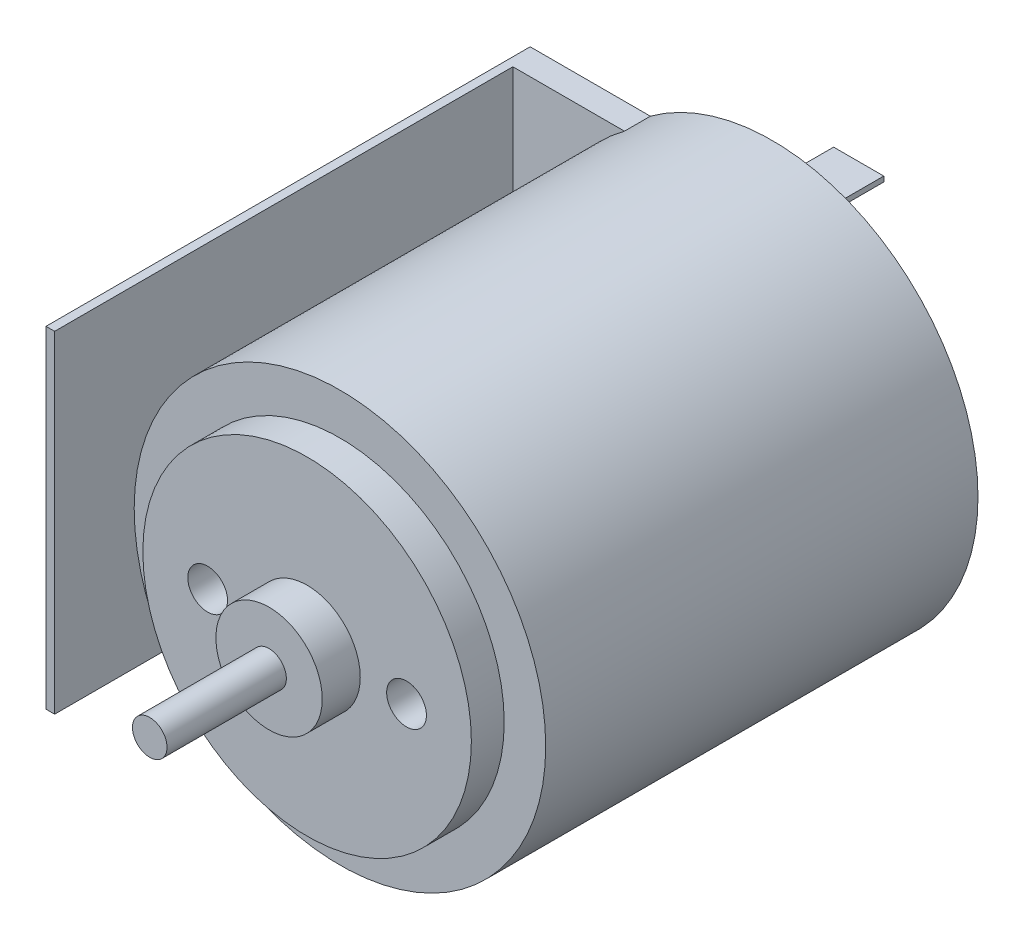
ISO-10303-21;
HEADER;
FILE_DESCRIPTION(('STEP AP214'),'2;1');
FILE_NAME('part.step','',(''),(''),'','','');
FILE_SCHEMA(('AUTOMOTIVE_DESIGN { 1 0 10303 214 1 1 1 1 }'));
ENDSEC;
DATA;
#1=APPLICATION_CONTEXT('core data for automotive mechanical design processes');
#2=APPLICATION_PROTOCOL_DEFINITION('international standard','automotive_design',2000,#1);
#3=PRODUCT_CONTEXT('',#1,'mechanical');
#4=PRODUCT('Part','Part','',(#3));
#5=PRODUCT_RELATED_PRODUCT_CATEGORY('part','',(#4));
#6=PRODUCT_DEFINITION_FORMATION('','',#4);
#7=PRODUCT_DEFINITION_CONTEXT('part definition',#1,'design');
#8=PRODUCT_DEFINITION('design','',#6,#7);
#9=PRODUCT_DEFINITION_SHAPE('','',#8);
#10=(LENGTH_UNIT() NAMED_UNIT(*) SI_UNIT(.MILLI.,.METRE.));
#11=(NAMED_UNIT(*) PLANE_ANGLE_UNIT() SI_UNIT($,.RADIAN.));
#12=(NAMED_UNIT(*) SI_UNIT($,.STERADIAN.) SOLID_ANGLE_UNIT());
#13=UNCERTAINTY_MEASURE_WITH_UNIT(LENGTH_MEASURE(1.E-05),#10,'distance_accuracy_value','');
#14=(GEOMETRIC_REPRESENTATION_CONTEXT(3) GLOBAL_UNCERTAINTY_ASSIGNED_CONTEXT((#13)) GLOBAL_UNIT_ASSIGNED_CONTEXT((#10,
#11,#12)) REPRESENTATION_CONTEXT('',''));
#15=CARTESIAN_POINT('',(0.,0.,0.));
#16=DIRECTION('',(0.,0.,1.));
#17=DIRECTION('',(1.,0.,0.));
#18=AXIS2_PLACEMENT_3D('',#15,#16,#17);
#19=CARTESIAN_POINT('',(0.,0.,0.));
#20=DIRECTION('',(0.,0.,1.));
#21=DIRECTION('',(1.,0.,0.));
#22=AXIS2_PLACEMENT_3D('',#19,#20,#21);
#23=PLANE('',#22);
#24=DIRECTION('',(-1.,0.,0.));
#25=VECTOR('',#24,1.);
#26=CARTESIAN_POINT('',(-4.,-9.5890064846753,0.));
#27=LINE('',#26,#25);
#28=CARTESIAN_POINT('',(-7.04705290436045,-9.5890064846753,0.));
#29=VERTEX_POINT('',#28);
#30=CARTESIAN_POINT('',(-14.,-9.5890064846753,0.));
#31=VERTEX_POINT('',#30);
#32=EDGE_CURVE('E193',#29,#31,#27,.T.);
#33=ORIENTED_EDGE('',*,*,#32,.T.);
#34=DIRECTION('',(0.,-1.,0.));
#35=VECTOR('',#34,1.);
#36=CARTESIAN_POINT('',(-14.,9.5890064846753,0.));
#37=LINE('',#36,#35);
#38=CARTESIAN_POINT('',(-14.,9.5890064846753,0.));
#39=VERTEX_POINT('',#38);
#40=EDGE_CURVE('E162',#39,#31,#37,.T.);
#41=ORIENTED_EDGE('',*,*,#40,.F.);
#42=DIRECTION('',(-1.,0.,0.));
#43=VECTOR('',#42,1.);
#44=CARTESIAN_POINT('',(-4.,9.5890064846753,0.));
#45=LINE('',#44,#43);
#46=CARTESIAN_POINT('',(-7.04705290436045,9.5890064846753,0.));
#47=VERTEX_POINT('',#46);
#48=EDGE_CURVE('E157',#47,#39,#45,.T.);
#49=ORIENTED_EDGE('',*,*,#48,.F.);
#50=CARTESIAN_POINT('',(0.,0.,0.));
#51=DIRECTION('',(0.,0.,1.));
#52=DIRECTION('',(1.,0.,0.));
#53=AXIS2_PLACEMENT_3D('',#50,#51,#52);
#54=CIRCLE('',#53,11.9);
#55=EDGE_CURVE('E283',#29,#47,#54,.T.);
#56=ORIENTED_EDGE('',*,*,#55,.F.);
#57=EDGE_LOOP('',(#33,#41,#49,#56));
#58=FACE_BOUND('',#57,.T.);
#59=CARTESIAN_POINT('',(0.,0.,0.));
#60=DIRECTION('',(0.,0.,1.));
#61=DIRECTION('',(1.,0.,0.));
#62=AXIS2_PLACEMENT_3D('',#59,#60,#61);
#63=CIRCLE('',#62,4.25);
#64=CARTESIAN_POINT('',(4.25,0.,0.));
#65=VERTEX_POINT('',#64);
#66=EDGE_CURVE('E290',#65,#65,#63,.T.);
#67=ORIENTED_EDGE('',*,*,#66,.T.);
#68=EDGE_LOOP('',(#67));
#69=FACE_BOUND('',#68,.T.);
#70=CARTESIAN_POINT('',(6.45,0.,0.));
#71=DIRECTION('',(0.,0.,-1.));
#72=DIRECTION('',(-1.,0.,0.));
#73=AXIS2_PLACEMENT_3D('',#70,#71,#72);
#74=CIRCLE('',#73,0.79999999999999);
#75=CARTESIAN_POINT('',(5.65000000000001,0.,0.));
#76=VERTEX_POINT('',#75);
#77=EDGE_CURVE('E202',#76,#76,#74,.T.);
#78=ORIENTED_EDGE('',*,*,#77,.F.);
#79=EDGE_LOOP('',(#78));
#80=FACE_BOUND('',#79,.T.);
#81=DIRECTION('',(-1.,0.,0.));
#82=VECTOR('',#81,1.);
#83=CARTESIAN_POINT('',(1.45,8.03971435369493,0.));
#84=LINE('',#83,#82);
#85=CARTESIAN_POINT('',(1.45,8.03971435369493,0.));
#86=VERTEX_POINT('',#85);
#87=CARTESIAN_POINT('',(-1.45,8.03971435369493,0.));
#88=VERTEX_POINT('',#87);
#89=EDGE_CURVE('E243',#86,#88,#84,.T.);
#90=ORIENTED_EDGE('',*,*,#89,.F.);
#91=DIRECTION('',(0.,-1.,0.));
#92=VECTOR('',#91,1.);
#93=CARTESIAN_POINT('',(1.45,8.33971435369493,0.));
#94=LINE('',#93,#92);
#95=CARTESIAN_POINT('',(1.45,8.33971435369493,0.));
#96=VERTEX_POINT('',#95);
#97=EDGE_CURVE('E255',#96,#86,#94,.T.);
#98=ORIENTED_EDGE('',*,*,#97,.F.);
#99=DIRECTION('',(-1.,0.,0.));
#100=VECTOR('',#99,1.);
#101=CARTESIAN_POINT('',(1.45,8.33971435369493,0.));
#102=LINE('',#101,#100);
#103=CARTESIAN_POINT('',(-1.45,8.33971435369493,0.));
#104=VERTEX_POINT('',#103);
#105=EDGE_CURVE('E268',#96,#104,#102,.T.);
#106=ORIENTED_EDGE('',*,*,#105,.T.);
#107=DIRECTION('',(0.,-1.,0.));
#108=VECTOR('',#107,1.);
#109=CARTESIAN_POINT('',(-1.45,8.33971435369493,0.));
#110=LINE('',#109,#108);
#111=EDGE_CURVE('E266',#104,#88,#110,.T.);
#112=ORIENTED_EDGE('',*,*,#111,.T.);
#113=EDGE_LOOP('',(#90,#98,#106,#112));
#114=FACE_BOUND('',#113,.T.);
#115=DIRECTION('',(1.,0.,0.));
#116=VECTOR('',#115,1.);
#117=CARTESIAN_POINT('',(-1.45000000000001,-7.50682965475162,0.));
#118=LINE('',#117,#116);
#119=CARTESIAN_POINT('',(-1.45000000000001,-7.50682965475162,0.));
#120=VERTEX_POINT('',#119);
#121=CARTESIAN_POINT('',(1.44999999999999,-7.50682965475162,0.));
#122=VERTEX_POINT('',#121);
#123=EDGE_CURVE('E240',#120,#122,#118,.T.);
#124=ORIENTED_EDGE('',*,*,#123,.F.);
#125=DIRECTION('',(0.,1.,0.));
#126=VECTOR('',#125,1.);
#127=CARTESIAN_POINT('',(-1.45000000000001,-7.80682965475162,0.));
#128=LINE('',#127,#126);
#129=CARTESIAN_POINT('',(-1.45000000000001,-7.80682965475162,0.));
#130=VERTEX_POINT('',#129);
#131=EDGE_CURVE('E232',#130,#120,#128,.T.);
#132=ORIENTED_EDGE('',*,*,#131,.F.);
#133=DIRECTION('',(1.,0.,0.));
#134=VECTOR('',#133,1.);
#135=CARTESIAN_POINT('',(-1.45000000000001,-7.80682965475162,0.));
#136=LINE('',#135,#134);
#137=CARTESIAN_POINT('',(1.44999999999999,-7.80682965475162,0.));
#138=VERTEX_POINT('',#137);
#139=EDGE_CURVE('E235',#130,#138,#136,.T.);
#140=ORIENTED_EDGE('',*,*,#139,.T.);
#141=DIRECTION('',(0.,1.,0.));
#142=VECTOR('',#141,1.);
#143=CARTESIAN_POINT('',(1.44999999999999,-7.80682965475162,0.));
#144=LINE('',#143,#142);
#145=EDGE_CURVE('E238',#138,#122,#144,.T.);
#146=ORIENTED_EDGE('',*,*,#145,.T.);
#147=EDGE_LOOP('',(#124,#132,#140,#146));
#148=FACE_BOUND('',#147,.T.);
#149=ADVANCED_FACE('F44',(#58,#69,#80,#114,#148),#23,.F.);
#150=CARTESIAN_POINT('',(0.,0.,36.));
#151=DIRECTION('',(0.,0.,-1.));
#152=DIRECTION('',(-1.,0.,0.));
#153=AXIS2_PLACEMENT_3D('',#150,#151,#152);
#154=CYLINDRICAL_SURFACE('',#153,1.);
#155=CARTESIAN_POINT('',(0.,0.,29.1));
#156=DIRECTION('',(0.,0.,1.));
#157=DIRECTION('',(1.,0.,0.));
#158=AXIS2_PLACEMENT_3D('',#155,#156,#157);
#159=CIRCLE('',#158,1.);
#160=CARTESIAN_POINT('',(1.,0.,29.1));
#161=VERTEX_POINT('',#160);
#162=EDGE_CURVE('E307',#161,#161,#159,.T.);
#163=ORIENTED_EDGE('',*,*,#162,.T.);
#164=EDGE_LOOP('',(#163));
#165=FACE_BOUND('',#164,.T.);
#166=CARTESIAN_POINT('',(0.,0.,36.));
#167=DIRECTION('',(0.,0.,1.));
#168=DIRECTION('',(1.,0.,0.));
#169=AXIS2_PLACEMENT_3D('',#166,#167,#168);
#170=CIRCLE('',#169,1.);
#171=CARTESIAN_POINT('',(1.,0.,36.));
#172=VERTEX_POINT('',#171);
#173=EDGE_CURVE('E313',#172,#172,#170,.T.);
#174=ORIENTED_EDGE('',*,*,#173,.F.);
#175=EDGE_LOOP('',(#174));
#176=FACE_BOUND('',#175,.T.);
#177=ADVANCED_FACE('F46',(#165,#176),#154,.T.);
#178=CARTESIAN_POINT('',(0.,0.,36.));
#179=DIRECTION('',(0.,0.,1.));
#180=DIRECTION('',(1.,0.,0.));
#181=AXIS2_PLACEMENT_3D('',#178,#179,#180);
#182=PLANE('',#181);
#183=ORIENTED_EDGE('',*,*,#173,.T.);
#184=EDGE_LOOP('',(#183));
#185=FACE_BOUND('',#184,.T.);
#186=ADVANCED_FACE('F428',(#185),#182,.T.);
#187=CARTESIAN_POINT('',(0.,0.,29.1));
#188=DIRECTION('',(0.,0.,-1.));
#189=DIRECTION('',(-1.,0.,0.));
#190=AXIS2_PLACEMENT_3D('',#187,#188,#189);
#191=CYLINDRICAL_SURFACE('',#190,3.075);
#192=CARTESIAN_POINT('',(0.,0.,26.9));
#193=DIRECTION('',(0.,0.,1.));
#194=DIRECTION('',(1.,0.,0.));
#195=AXIS2_PLACEMENT_3D('',#192,#193,#194);
#196=CIRCLE('',#195,3.075);
#197=CARTESIAN_POINT('',(3.075,0.,26.9));
#198=VERTEX_POINT('',#197);
#199=EDGE_CURVE('E295',#198,#198,#196,.T.);
#200=ORIENTED_EDGE('',*,*,#199,.T.);
#201=EDGE_LOOP('',(#200));
#202=FACE_BOUND('',#201,.T.);
#203=CARTESIAN_POINT('',(0.,0.,29.1));
#204=DIRECTION('',(0.,0.,1.));
#205=DIRECTION('',(1.,0.,0.));
#206=AXIS2_PLACEMENT_3D('',#203,#204,#205);
#207=CIRCLE('',#206,3.075);
#208=CARTESIAN_POINT('',(3.075,0.,29.1));
#209=VERTEX_POINT('',#208);
#210=EDGE_CURVE('E310',#209,#209,#207,.T.);
#211=ORIENTED_EDGE('',*,*,#210,.F.);
#212=EDGE_LOOP('',(#211));
#213=FACE_BOUND('',#212,.T.);
#214=ADVANCED_FACE('F424',(#202,#213),#191,.T.);
#215=CARTESIAN_POINT('',(0.,0.,29.1));
#216=DIRECTION('',(0.,0.,1.));
#217=DIRECTION('',(1.,0.,0.));
#218=AXIS2_PLACEMENT_3D('',#215,#216,#217);
#219=PLANE('',#218);
#220=ORIENTED_EDGE('',*,*,#162,.F.);
#221=EDGE_LOOP('',(#220));
#222=FACE_BOUND('',#221,.T.);
#223=ORIENTED_EDGE('',*,*,#210,.T.);
#224=EDGE_LOOP('',(#223));
#225=FACE_BOUND('',#224,.T.);
#226=ADVANCED_FACE('F409',(#222,#225),#219,.T.);
#227=CARTESIAN_POINT('',(0.,0.,26.9));
#228=DIRECTION('',(0.,0.,1.));
#229=DIRECTION('',(1.,0.,0.));
#230=AXIS2_PLACEMENT_3D('',#227,#228,#229);
#231=PLANE('',#230);
#232=CARTESIAN_POINT('',(5.75,0.,26.9));
#233=DIRECTION('',(0.,0.,1.));
#234=DIRECTION('',(1.,0.,0.));
#235=AXIS2_PLACEMENT_3D('',#232,#233,#234);
#236=CIRCLE('',#235,1.15);
#237=CARTESIAN_POINT('',(6.9,0.,26.9));
#238=VERTEX_POINT('',#237);
#239=EDGE_CURVE('E203',#238,#238,#236,.T.);
#240=ORIENTED_EDGE('',*,*,#239,.F.);
#241=EDGE_LOOP('',(#240));
#242=FACE_BOUND('',#241,.T.);
#243=CARTESIAN_POINT('',(-5.75,0.,26.9));
#244=DIRECTION('',(0.,0.,1.));
#245=DIRECTION('',(1.,0.,0.));
#246=AXIS2_PLACEMENT_3D('',#243,#244,#245);
#247=CIRCLE('',#246,1.15);
#248=CARTESIAN_POINT('',(-4.6,0.,26.9));
#249=VERTEX_POINT('',#248);
#250=EDGE_CURVE('E206',#249,#249,#247,.T.);
#251=ORIENTED_EDGE('',*,*,#250,.F.);
#252=EDGE_LOOP('',(#251));
#253=FACE_BOUND('',#252,.T.);
#254=ORIENTED_EDGE('',*,*,#199,.F.);
#255=EDGE_LOOP('',(#254));
#256=FACE_BOUND('',#255,.T.);
#257=CARTESIAN_POINT('',(0.,0.,26.9));
#258=DIRECTION('',(0.,0.,1.));
#259=DIRECTION('',(1.,0.,0.));
#260=AXIS2_PLACEMENT_3D('',#257,#258,#259);
#261=CIRCLE('',#260,9.5);
#262=CARTESIAN_POINT('',(-9.5,0.,26.9));
#263=VERTEX_POINT('',#262);
#264=EDGE_CURVE('E292',#263,#263,#261,.T.);
#265=ORIENTED_EDGE('',*,*,#264,.T.);
#266=EDGE_LOOP('',(#265));
#267=FACE_BOUND('',#266,.T.);
#268=ADVANCED_FACE('F405',(#242,#253,#256,#267),#231,.T.);
#269=CARTESIAN_POINT('',(0.,0.,26.9));
#270=DIRECTION('',(0.,0.,-1.));
#271=DIRECTION('',(-1.,0.,0.));
#272=AXIS2_PLACEMENT_3D('',#269,#270,#271);
#273=CYLINDRICAL_SURFACE('',#272,9.5);
#274=CARTESIAN_POINT('',(0.,0.,25.));
#275=DIRECTION('',(0.,0.,1.));
#276=DIRECTION('',(1.,0.,0.));
#277=AXIS2_PLACEMENT_3D('',#274,#275,#276);
#278=CIRCLE('',#277,9.5);
#279=CARTESIAN_POINT('',(-9.5,0.,25.));
#280=VERTEX_POINT('',#279);
#281=EDGE_CURVE('E284',#280,#280,#278,.T.);
#282=CARTESIAN_POINT('',(-9.5,0.,25.));
#283=CARTESIAN_POINT('',(-9.5,0.,25.0197916666667));
#284=CARTESIAN_POINT('',(-9.5,0.,25.0395833333333));
#285=CARTESIAN_POINT('',(-9.5,0.,25.0791666666667));
#286=CARTESIAN_POINT('',(-9.5,0.,25.0989583333333));
#287=CARTESIAN_POINT('',(-9.5,0.,25.1385416666667));
#288=CARTESIAN_POINT('',(-9.5,0.,25.1583333333333));
#289=CARTESIAN_POINT('',(-9.5,0.,25.1979166666667));
#290=CARTESIAN_POINT('',(-9.5,0.,25.2177083333333));
#291=CARTESIAN_POINT('',(-9.5,0.,25.2572916666667));
#292=CARTESIAN_POINT('',(-9.5,0.,25.2770833333333));
#293=CARTESIAN_POINT('',(-9.5,0.,25.3166666666667));
#294=CARTESIAN_POINT('',(-9.5,0.,25.3364583333333));
#295=CARTESIAN_POINT('',(-9.5,0.,25.3760416666667));
#296=CARTESIAN_POINT('',(-9.5,0.,25.3958333333333));
#297=CARTESIAN_POINT('',(-9.5,0.,25.4354166666667));
#298=CARTESIAN_POINT('',(-9.5,0.,25.4552083333333));
#299=CARTESIAN_POINT('',(-9.5,0.,25.4947916666667));
#300=CARTESIAN_POINT('',(-9.5,0.,25.5145833333333));
#301=CARTESIAN_POINT('',(-9.5,0.,25.5541666666667));
#302=CARTESIAN_POINT('',(-9.5,0.,25.5739583333333));
#303=CARTESIAN_POINT('',(-9.5,0.,25.6135416666667));
#304=CARTESIAN_POINT('',(-9.5,0.,25.6333333333333));
#305=CARTESIAN_POINT('',(-9.5,0.,25.6729166666667));
#306=CARTESIAN_POINT('',(-9.5,0.,25.6927083333333));
#307=CARTESIAN_POINT('',(-9.5,0.,25.7322916666667));
#308=CARTESIAN_POINT('',(-9.5,0.,25.7520833333333));
#309=CARTESIAN_POINT('',(-9.5,0.,25.7916666666667));
#310=CARTESIAN_POINT('',(-9.5,0.,25.8114583333333));
#311=CARTESIAN_POINT('',(-9.5,0.,25.8510416666667));
#312=CARTESIAN_POINT('',(-9.5,0.,25.8708333333333));
#313=CARTESIAN_POINT('',(-9.5,0.,25.9104166666667));
#314=CARTESIAN_POINT('',(-9.5,0.,25.9302083333333));
#315=CARTESIAN_POINT('',(-9.5,0.,25.9697916666667));
#316=CARTESIAN_POINT('',(-9.5,0.,25.9895833333333));
#317=CARTESIAN_POINT('',(-9.5,0.,26.0291666666667));
#318=CARTESIAN_POINT('',(-9.5,0.,26.0489583333333));
#319=CARTESIAN_POINT('',(-9.5,0.,26.0885416666667));
#320=CARTESIAN_POINT('',(-9.5,0.,26.1083333333333));
#321=CARTESIAN_POINT('',(-9.5,0.,26.1479166666667));
#322=CARTESIAN_POINT('',(-9.5,0.,26.1677083333333));
#323=CARTESIAN_POINT('',(-9.5,0.,26.2072916666667));
#324=CARTESIAN_POINT('',(-9.5,0.,26.2270833333333));
#325=CARTESIAN_POINT('',(-9.5,0.,26.2666666666667));
#326=CARTESIAN_POINT('',(-9.5,0.,26.2864583333333));
#327=CARTESIAN_POINT('',(-9.5,0.,26.3260416666667));
#328=CARTESIAN_POINT('',(-9.5,0.,26.3458333333333));
#329=CARTESIAN_POINT('',(-9.5,0.,26.3854166666667));
#330=CARTESIAN_POINT('',(-9.5,0.,26.4052083333333));
#331=CARTESIAN_POINT('',(-9.5,0.,26.4447916666667));
#332=CARTESIAN_POINT('',(-9.5,0.,26.4645833333333));
#333=CARTESIAN_POINT('',(-9.5,0.,26.5041666666667));
#334=CARTESIAN_POINT('',(-9.5,0.,26.5239583333333));
#335=CARTESIAN_POINT('',(-9.5,0.,26.5635416666667));
#336=CARTESIAN_POINT('',(-9.5,0.,26.5833333333333));
#337=CARTESIAN_POINT('',(-9.5,0.,26.6229166666667));
#338=CARTESIAN_POINT('',(-9.5,0.,26.6427083333333));
#339=CARTESIAN_POINT('',(-9.5,0.,26.6822916666667));
#340=CARTESIAN_POINT('',(-9.5,0.,26.7020833333333));
#341=CARTESIAN_POINT('',(-9.5,0.,26.7416666666667));
#342=CARTESIAN_POINT('',(-9.5,0.,26.7614583333333));
#343=CARTESIAN_POINT('',(-9.5,0.,26.8010416666667));
#344=CARTESIAN_POINT('',(-9.5,0.,26.8208333333333));
#345=CARTESIAN_POINT('',(-9.5,0.,26.8604166666667));
#346=CARTESIAN_POINT('',(-9.5,0.,26.8802083333333));
#347=CARTESIAN_POINT('',(-9.5,0.,26.9));
#348=B_SPLINE_CURVE_WITH_KNOTS('',3,(#282,#283,#284,#285,#286,#287,#288,#289,#290,#291,#292,
#293,#294,#295,#296,#297,#298,#299,#300,#301,#302,#303,#304,#305,#306,#307,#308,#309,#310,#311,
#312,#313,#314,#315,#316,#317,#318,#319,#320,#321,#322,#323,#324,#325,#326,#327,#328,#329,#330,
#331,#332,#333,#334,#335,#336,#337,#338,#339,#340,#341,#342,#343,#344,#345,#346,#347),
.UNSPECIFIED.,.F.,.F.,(4,2,2,2,2,2,2,2,2,2,2,2,2,2,2,2,2,2,2,2,2,2,2,2,2,2,2,2,2,2,2,2,4),(0.,
0.0593750000000004,0.118750000000001,0.178125000000001,0.237500000000002,0.296875000000002,
0.356250000000002,0.415625000000003,0.475,0.534375,0.593750000000001,0.653125000000001,
0.712500000000001,0.771875000000002,0.831250000000002,0.890625000000003,0.95,1.009375,1.06875,
1.128125,1.1875,1.246875,1.30625,1.365625,1.425,1.484375,1.54375,1.603125,1.6625,1.721875,
1.78125,1.840625,1.9),.UNSPECIFIED.);
#349=EDGE_CURVE('BSEAM400',#280,#263,#348,.T.);
#350=ORIENTED_EDGE('',*,*,#281,.T.);
#351=ORIENTED_EDGE('',*,*,#264,.F.);
#352=ORIENTED_EDGE('',*,*,#349,.T.);
#353=ORIENTED_EDGE('',*,*,#349,.F.);
#354=EDGE_LOOP('',(#350,#352,#351,#353));
#355=FACE_BOUND('',#354,.T.);
#356=ADVANCED_FACE('F400',(#355),#273,.T.);
#357=CARTESIAN_POINT('',(0.,0.,25.));
#358=DIRECTION('',(0.,0.,-1.));
#359=DIRECTION('',(-1.,0.,0.));
#360=AXIS2_PLACEMENT_3D('',#357,#358,#359);
#361=CYLINDRICAL_SURFACE('',#360,11.9);
#362=CARTESIAN_POINT('',(0.,0.,25.));
#363=DIRECTION('',(0.,0.,1.));
#364=DIRECTION('',(1.,0.,0.));
#365=AXIS2_PLACEMENT_3D('',#362,#363,#364);
#366=CIRCLE('',#365,11.9);
#367=CARTESIAN_POINT('',(11.9,0.,25.));
#368=VERTEX_POINT('',#367);
#369=EDGE_CURVE('E287',#368,#368,#366,.T.);
#370=ORIENTED_EDGE('',*,*,#369,.F.);
#371=EDGE_LOOP('',(#370));
#372=FACE_BOUND('',#371,.T.);
#373=ORIENTED_EDGE('',*,*,#55,.T.);
#374=DIRECTION('',(0.,0.,-1.));
#375=VECTOR('',#374,1.);
#376=CARTESIAN_POINT('',(-7.04705290436045,9.5890064846753,25.));
#377=LINE('',#376,#375);
#378=CARTESIAN_POINT('',(-7.04705290436045,9.5890064846753,1.5));
#379=VERTEX_POINT('',#378);
#380=EDGE_CURVE('E53',#47,#379,#377,.F.);
#381=ORIENTED_EDGE('',*,*,#380,.T.);
#382=CARTESIAN_POINT('',(0.,0.,1.5));
#383=DIRECTION('',(0.,0.,1.));
#384=DIRECTION('',(0.,-1.,0.));
#385=AXIS2_PLACEMENT_3D('',#382,#383,#384);
#386=CIRCLE('',#385,11.9);
#387=CARTESIAN_POINT('',(-7.04705290436045,-9.5890064846753,1.5));
#388=VERTEX_POINT('',#387);
#389=EDGE_CURVE('E196',#379,#388,#386,.T.);
#390=ORIENTED_EDGE('',*,*,#389,.T.);
#391=DIRECTION('',(0.,0.,-1.));
#392=VECTOR('',#391,1.);
#393=CARTESIAN_POINT('',(-7.04705290436045,-9.5890064846753,25.));
#394=LINE('',#393,#392);
#395=EDGE_CURVE('E318',#388,#29,#394,.T.);
#396=ORIENTED_EDGE('',*,*,#395,.T.);
#397=EDGE_LOOP('',(#373,#381,#390,#396));
#398=FACE_BOUND('',#397,.T.);
#399=ADVANCED_FACE('F323',(#372,#398),#361,.T.);
#400=CARTESIAN_POINT('',(0.,0.,25.));
#401=DIRECTION('',(0.,0.,1.));
#402=DIRECTION('',(1.,0.,0.));
#403=AXIS2_PLACEMENT_3D('',#400,#401,#402);
#404=PLANE('',#403);
#405=ORIENTED_EDGE('',*,*,#281,.F.);
#406=EDGE_LOOP('',(#405));
#407=FACE_BOUND('',#406,.T.);
#408=ORIENTED_EDGE('',*,*,#369,.T.);
#409=EDGE_LOOP('',(#408));
#410=FACE_BOUND('',#409,.T.);
#411=ADVANCED_FACE('F394',(#407,#410),#404,.T.);
#412=CARTESIAN_POINT('',(0.,0.,0.));
#413=DIRECTION('',(0.,0.,1.));
#414=DIRECTION('',(1.,0.,0.));
#415=AXIS2_PLACEMENT_3D('',#412,#413,#414);
#416=PLANE('',#415);
#417=CARTESIAN_POINT('',(0.,0.,0.));
#418=DIRECTION('',(0.,0.,1.));
#419=DIRECTION('',(1.,0.,0.));
#420=AXIS2_PLACEMENT_3D('',#417,#418,#419);
#421=CIRCLE('',#420,3.075);
#422=CARTESIAN_POINT('',(3.075,0.,0.));
#423=VERTEX_POINT('',#422);
#424=EDGE_CURVE('E306',#423,#423,#421,.T.);
#425=ORIENTED_EDGE('',*,*,#424,.F.);
#426=EDGE_LOOP('',(#425));
#427=FACE_BOUND('',#426,.T.);
#428=ADVANCED_FACE('F397',(#427),#416,.F.);
#429=CARTESIAN_POINT('',(0.,0.,-2.));
#430=DIRECTION('',(0.,0.,1.));
#431=DIRECTION('',(1.,0.,0.));
#432=AXIS2_PLACEMENT_3D('',#429,#430,#431);
#433=CYLINDRICAL_SURFACE('',#432,3.075);
#434=CARTESIAN_POINT('',(0.,0.,-2.));
#435=DIRECTION('',(0.,0.,1.));
#436=DIRECTION('',(1.,0.,0.));
#437=AXIS2_PLACEMENT_3D('',#434,#435,#436);
#438=CIRCLE('',#437,3.075);
#439=CARTESIAN_POINT('',(3.075,0.,-2.));
#440=VERTEX_POINT('',#439);
#441=EDGE_CURVE('E300',#440,#440,#438,.T.);
#442=ORIENTED_EDGE('',*,*,#441,.F.);
#443=EDGE_LOOP('',(#442));
#444=FACE_BOUND('',#443,.T.);
#445=ORIENTED_EDGE('',*,*,#424,.T.);
#446=EDGE_LOOP('',(#445));
#447=FACE_BOUND('',#446,.T.);
#448=ADVANCED_FACE('F414',(#444,#447),#433,.F.);
#449=CARTESIAN_POINT('',(0.,0.,-2.));
#450=DIRECTION('',(0.,0.,1.));
#451=DIRECTION('',(1.,0.,0.));
#452=AXIS2_PLACEMENT_3D('',#449,#450,#451);
#453=PLANE('',#452);
#454=ORIENTED_EDGE('',*,*,#441,.T.);
#455=EDGE_LOOP('',(#454));
#456=FACE_BOUND('',#455,.T.);
#457=CARTESIAN_POINT('',(0.,0.,-2.));
#458=DIRECTION('',(0.,0.,1.));
#459=DIRECTION('',(1.,0.,0.));
#460=AXIS2_PLACEMENT_3D('',#457,#458,#459);
#461=CIRCLE('',#460,4.25);
#462=CARTESIAN_POINT('',(4.25,0.,-2.));
#463=VERTEX_POINT('',#462);
#464=EDGE_CURVE('E303',#463,#463,#461,.T.);
#465=ORIENTED_EDGE('',*,*,#464,.F.);
#466=EDGE_LOOP('',(#465));
#467=FACE_BOUND('',#466,.T.);
#468=ADVANCED_FACE('F411',(#456,#467),#453,.F.);
#469=CARTESIAN_POINT('',(0.,0.,-2.));
#470=DIRECTION('',(0.,0.,1.));
#471=DIRECTION('',(1.,0.,0.));
#472=AXIS2_PLACEMENT_3D('',#469,#470,#471);
#473=CYLINDRICAL_SURFACE('',#472,4.25);
#474=ORIENTED_EDGE('',*,*,#464,.T.);
#475=EDGE_LOOP('',(#474));
#476=FACE_BOUND('',#475,.T.);
#477=ORIENTED_EDGE('',*,*,#66,.F.);
#478=EDGE_LOOP('',(#477));
#479=FACE_BOUND('',#478,.T.);
#480=ADVANCED_FACE('F392',(#476,#479),#473,.T.);
#481=CARTESIAN_POINT('',(1.45,8.03971435369493,-5.));
#482=DIRECTION('',(0.,1.,0.));
#483=DIRECTION('',(0.,0.,1.));
#484=AXIS2_PLACEMENT_3D('',#481,#482,#483);
#485=PLANE('',#484);
#486=ORIENTED_EDGE('',*,*,#89,.T.);
#487=DIRECTION('',(0.,0.,1.));
#488=VECTOR('',#487,1.);
#489=CARTESIAN_POINT('',(-1.45,8.03971435369493,-5.));
#490=LINE('',#489,#488);
#491=CARTESIAN_POINT('',(-1.45,8.03971435369493,-5.));
#492=VERTEX_POINT('',#491);
#493=EDGE_CURVE('E280',#492,#88,#490,.T.);
#494=ORIENTED_EDGE('',*,*,#493,.F.);
#495=DIRECTION('',(-1.,0.,0.));
#496=VECTOR('',#495,1.);
#497=CARTESIAN_POINT('',(1.45,8.03971435369493,-5.));
#498=LINE('',#497,#496);
#499=CARTESIAN_POINT('',(1.45,8.03971435369493,-5.));
#500=VERTEX_POINT('',#499);
#501=EDGE_CURVE('E252',#500,#492,#498,.T.);
#502=ORIENTED_EDGE('',*,*,#501,.F.);
#503=DIRECTION('',(0.,0.,1.));
#504=VECTOR('',#503,1.);
#505=CARTESIAN_POINT('',(1.45,8.03971435369493,-5.));
#506=LINE('',#505,#504);
#507=EDGE_CURVE('E263',#500,#86,#506,.T.);
#508=ORIENTED_EDGE('',*,*,#507,.T.);
#509=EDGE_LOOP('',(#486,#494,#502,#508));
#510=FACE_BOUND('',#509,.T.);
#511=ADVANCED_FACE('F388',(#510),#485,.F.);
#512=CARTESIAN_POINT('',(-1.45,8.33971435369493,-5.));
#513=DIRECTION('',(-1.,0.,0.));
#514=DIRECTION('',(0.,-1.,0.));
#515=AXIS2_PLACEMENT_3D('',#512,#513,#514);
#516=PLANE('',#515);
#517=ORIENTED_EDGE('',*,*,#111,.F.);
#518=DIRECTION('',(0.,0.,1.));
#519=VECTOR('',#518,1.);
#520=CARTESIAN_POINT('',(-1.45,8.33971435369493,-5.));
#521=LINE('',#520,#519);
#522=CARTESIAN_POINT('',(-1.45,8.33971435369493,-5.));
#523=VERTEX_POINT('',#522);
#524=EDGE_CURVE('E277',#523,#104,#521,.T.);
#525=ORIENTED_EDGE('',*,*,#524,.F.);
#526=DIRECTION('',(0.,-1.,0.));
#527=VECTOR('',#526,1.);
#528=CARTESIAN_POINT('',(-1.45,8.33971435369493,-5.));
#529=LINE('',#528,#527);
#530=EDGE_CURVE('E254',#523,#492,#529,.T.);
#531=ORIENTED_EDGE('',*,*,#530,.T.);
#532=ORIENTED_EDGE('',*,*,#493,.T.);
#533=EDGE_LOOP('',(#517,#525,#531,#532));
#534=FACE_BOUND('',#533,.T.);
#535=ADVANCED_FACE('F384',(#534),#516,.T.);
#536=CARTESIAN_POINT('',(1.45,8.33971435369493,-5.));
#537=DIRECTION('',(0.,1.,0.));
#538=DIRECTION('',(0.,0.,1.));
#539=AXIS2_PLACEMENT_3D('',#536,#537,#538);
#540=PLANE('',#539);
#541=ORIENTED_EDGE('',*,*,#105,.F.);
#542=DIRECTION('',(0.,0.,1.));
#543=VECTOR('',#542,1.);
#544=CARTESIAN_POINT('',(1.45,8.33971435369493,-5.));
#545=LINE('',#544,#543);
#546=CARTESIAN_POINT('',(1.45,8.33971435369493,-5.));
#547=VERTEX_POINT('',#546);
#548=EDGE_CURVE('E274',#547,#96,#545,.T.);
#549=ORIENTED_EDGE('',*,*,#548,.F.);
#550=DIRECTION('',(-1.,0.,0.));
#551=VECTOR('',#550,1.);
#552=CARTESIAN_POINT('',(1.45,8.33971435369493,-5.));
#553=LINE('',#552,#551);
#554=EDGE_CURVE('E258',#547,#523,#553,.T.);
#555=ORIENTED_EDGE('',*,*,#554,.T.);
#556=ORIENTED_EDGE('',*,*,#524,.T.);
#557=EDGE_LOOP('',(#541,#549,#555,#556));
#558=FACE_BOUND('',#557,.T.);
#559=ADVANCED_FACE('F380',(#558),#540,.T.);
#560=CARTESIAN_POINT('',(1.45,8.33971435369493,-5.));
#561=DIRECTION('',(-1.,0.,0.));
#562=DIRECTION('',(0.,0.,1.));
#563=AXIS2_PLACEMENT_3D('',#560,#561,#562);
#564=PLANE('',#563);
#565=ORIENTED_EDGE('',*,*,#97,.T.);
#566=ORIENTED_EDGE('',*,*,#507,.F.);
#567=DIRECTION('',(0.,-1.,0.));
#568=VECTOR('',#567,1.);
#569=CARTESIAN_POINT('',(1.45,8.33971435369493,-5.));
#570=LINE('',#569,#568);
#571=EDGE_CURVE('E261',#547,#500,#570,.T.);
#572=ORIENTED_EDGE('',*,*,#571,.F.);
#573=ORIENTED_EDGE('',*,*,#548,.T.);
#574=EDGE_LOOP('',(#565,#566,#572,#573));
#575=FACE_BOUND('',#574,.T.);
#576=ADVANCED_FACE('F376',(#575),#564,.F.);
#577=CARTESIAN_POINT('',(0.,0.,-5.));
#578=DIRECTION('',(0.,0.,1.));
#579=DIRECTION('',(1.,0.,0.));
#580=AXIS2_PLACEMENT_3D('',#577,#578,#579);
#581=PLANE('',#580);
#582=ORIENTED_EDGE('',*,*,#501,.T.);
#583=ORIENTED_EDGE('',*,*,#530,.F.);
#584=ORIENTED_EDGE('',*,*,#554,.F.);
#585=ORIENTED_EDGE('',*,*,#571,.T.);
#586=EDGE_LOOP('',(#582,#583,#584,#585));
#587=FACE_BOUND('',#586,.T.);
#588=ADVANCED_FACE('F365',(#587),#581,.F.);
#589=CARTESIAN_POINT('',(-1.45000000000001,-7.50682965475162,-5.));
#590=DIRECTION('',(0.,-1.,0.));
#591=DIRECTION('',(0.,0.,-1.));
#592=AXIS2_PLACEMENT_3D('',#589,#590,#591);
#593=PLANE('',#592);
#594=ORIENTED_EDGE('',*,*,#123,.T.);
#595=DIRECTION('',(0.,0.,1.));
#596=VECTOR('',#595,1.);
#597=CARTESIAN_POINT('',(1.44999999999999,-7.50682965475162,-5.));
#598=LINE('',#597,#596);
#599=CARTESIAN_POINT('',(1.44999999999999,-7.50682965475162,-5.));
#600=VERTEX_POINT('',#599);
#601=EDGE_CURVE('E219',#600,#122,#598,.T.);
#602=ORIENTED_EDGE('',*,*,#601,.F.);
#603=DIRECTION('',(1.,0.,0.));
#604=VECTOR('',#603,1.);
#605=CARTESIAN_POINT('',(-1.45000000000001,-7.50682965475162,-5.));
#606=LINE('',#605,#604);
#607=CARTESIAN_POINT('',(-1.45000000000001,-7.50682965475162,-5.));
#608=VERTEX_POINT('',#607);
#609=EDGE_CURVE('E236',#608,#600,#606,.T.);
#610=ORIENTED_EDGE('',*,*,#609,.F.);
#611=DIRECTION('',(0.,0.,1.));
#612=VECTOR('',#611,1.);
#613=CARTESIAN_POINT('',(-1.45000000000001,-7.50682965475162,-5.));
#614=LINE('',#613,#612);
#615=EDGE_CURVE('E228',#608,#120,#614,.T.);
#616=ORIENTED_EDGE('',*,*,#615,.T.);
#617=EDGE_LOOP('',(#594,#602,#610,#616));
#618=FACE_BOUND('',#617,.T.);
#619=ADVANCED_FACE('F349',(#618),#593,.F.);
#620=CARTESIAN_POINT('',(1.44999999999999,-7.80682965475162,-5.));
#621=DIRECTION('',(1.,0.,0.));
#622=DIRECTION('',(0.,0.,-1.));
#623=AXIS2_PLACEMENT_3D('',#620,#621,#622);
#624=PLANE('',#623);
#625=ORIENTED_EDGE('',*,*,#145,.F.);
#626=DIRECTION('',(0.,0.,1.));
#627=VECTOR('',#626,1.);
#628=CARTESIAN_POINT('',(1.44999999999999,-7.80682965475162,-5.));
#629=LINE('',#628,#627);
#630=CARTESIAN_POINT('',(1.44999999999999,-7.80682965475162,-5.));
#631=VERTEX_POINT('',#630);
#632=EDGE_CURVE('E222',#631,#138,#629,.T.);
#633=ORIENTED_EDGE('',*,*,#632,.F.);
#634=DIRECTION('',(0.,1.,0.));
#635=VECTOR('',#634,1.);
#636=CARTESIAN_POINT('',(1.44999999999999,-7.80682965475162,-5.));
#637=LINE('',#636,#635);
#638=EDGE_CURVE('E248',#631,#600,#637,.T.);
#639=ORIENTED_EDGE('',*,*,#638,.T.);
#640=ORIENTED_EDGE('',*,*,#601,.T.);
#641=EDGE_LOOP('',(#625,#633,#639,#640));
#642=FACE_BOUND('',#641,.T.);
#643=ADVANCED_FACE('F357',(#642),#624,.T.);
#644=CARTESIAN_POINT('',(-1.45000000000001,-7.80682965475162,-5.));
#645=DIRECTION('',(0.,-1.,0.));
#646=DIRECTION('',(0.,0.,-1.));
#647=AXIS2_PLACEMENT_3D('',#644,#645,#646);
#648=PLANE('',#647);
#649=ORIENTED_EDGE('',*,*,#139,.F.);
#650=DIRECTION('',(0.,0.,1.));
#651=VECTOR('',#650,1.);
#652=CARTESIAN_POINT('',(-1.45000000000001,-7.80682965475162,-5.));
#653=LINE('',#652,#651);
#654=CARTESIAN_POINT('',(-1.45000000000001,-7.80682965475162,-5.));
#655=VERTEX_POINT('',#654);
#656=EDGE_CURVE('E225',#655,#130,#653,.T.);
#657=ORIENTED_EDGE('',*,*,#656,.F.);
#658=DIRECTION('',(1.,0.,0.));
#659=VECTOR('',#658,1.);
#660=CARTESIAN_POINT('',(-1.45000000000001,-7.80682965475162,-5.));
#661=LINE('',#660,#659);
#662=EDGE_CURVE('E245',#655,#631,#661,.T.);
#663=ORIENTED_EDGE('',*,*,#662,.T.);
#664=ORIENTED_EDGE('',*,*,#632,.T.);
#665=EDGE_LOOP('',(#649,#657,#663,#664));
#666=FACE_BOUND('',#665,.T.);
#667=ADVANCED_FACE('F355',(#666),#648,.T.);
#668=CARTESIAN_POINT('',(-1.45000000000001,-7.80682965475162,-5.));
#669=DIRECTION('',(1.,0.,0.));
#670=DIRECTION('',(0.,0.,-1.));
#671=AXIS2_PLACEMENT_3D('',#668,#669,#670);
#672=PLANE('',#671);
#673=ORIENTED_EDGE('',*,*,#131,.T.);
#674=ORIENTED_EDGE('',*,*,#615,.F.);
#675=DIRECTION('',(0.,1.,0.));
#676=VECTOR('',#675,1.);
#677=CARTESIAN_POINT('',(-1.45000000000001,-7.80682965475162,-5.));
#678=LINE('',#677,#676);
#679=EDGE_CURVE('E231',#655,#608,#678,.T.);
#680=ORIENTED_EDGE('',*,*,#679,.F.);
#681=ORIENTED_EDGE('',*,*,#656,.T.);
#682=EDGE_LOOP('',(#673,#674,#680,#681));
#683=FACE_BOUND('',#682,.T.);
#684=ADVANCED_FACE('F345',(#683),#672,.F.);
#685=CARTESIAN_POINT('',(0.,0.,-5.));
#686=DIRECTION('',(0.,0.,1.));
#687=DIRECTION('',(1.,0.,0.));
#688=AXIS2_PLACEMENT_3D('',#685,#686,#687);
#689=PLANE('',#688);
#690=ORIENTED_EDGE('',*,*,#609,.T.);
#691=ORIENTED_EDGE('',*,*,#638,.F.);
#692=ORIENTED_EDGE('',*,*,#662,.F.);
#693=ORIENTED_EDGE('',*,*,#679,.T.);
#694=EDGE_LOOP('',(#690,#691,#692,#693));
#695=FACE_BOUND('',#694,.T.);
#696=ADVANCED_FACE('F352',(#695),#689,.F.);
#697=CARTESIAN_POINT('',(6.45,0.,6.00000000000001));
#698=DIRECTION('',(0.,0.,-1.));
#699=DIRECTION('',(-1.,0.,0.));
#700=AXIS2_PLACEMENT_3D('',#697,#698,#699);
#701=CONICAL_SURFACE('',#700,0.799999999999988,1.02974425867665);
#702=CARTESIAN_POINT('',(6.45,0.,6.48068849522205));
#703=VERTEX_POINT('',#702);
#704=VERTEX_LOOP('',#703);
#705=FACE_BOUND('',#704,.T.);
#706=CARTESIAN_POINT('',(6.45,0.,6.00000000000001));
#707=DIRECTION('',(0.,0.,-1.));
#708=DIRECTION('',(-1.,0.,0.));
#709=AXIS2_PLACEMENT_3D('',#706,#707,#708);
#710=CIRCLE('',#709,0.799999999999988);
#711=CARTESIAN_POINT('',(5.65000000000001,0.,6.00000000000001));
#712=VERTEX_POINT('',#711);
#713=EDGE_CURVE('E213',#712,#712,#710,.T.);
#714=ORIENTED_EDGE('',*,*,#713,.T.);
#715=EDGE_LOOP('',(#714));
#716=FACE_BOUND('',#715,.T.);
#717=ADVANCED_FACE('F373',(#705,#716),#701,.F.);
#718=CARTESIAN_POINT('',(6.45,0.,0.));
#719=DIRECTION('',(0.,0.,-1.));
#720=DIRECTION('',(-1.,0.,0.));
#721=AXIS2_PLACEMENT_3D('',#718,#719,#720);
#722=CYLINDRICAL_SURFACE('',#721,0.799999999999989);
#723=ORIENTED_EDGE('',*,*,#713,.F.);
#724=EDGE_LOOP('',(#723));
#725=FACE_BOUND('',#724,.T.);
#726=ORIENTED_EDGE('',*,*,#77,.T.);
#727=EDGE_LOOP('',(#726));
#728=FACE_BOUND('',#727,.T.);
#729=ADVANCED_FACE('F534',(#725,#728),#722,.F.);
#730=CARTESIAN_POINT('',(-5.75,0.,23.9));
#731=DIRECTION('',(0.,0.,1.));
#732=DIRECTION('',(1.,0.,0.));
#733=AXIS2_PLACEMENT_3D('',#730,#731,#732);
#734=CYLINDRICAL_SURFACE('',#733,1.15);
#735=CARTESIAN_POINT('',(-5.75,0.,23.9));
#736=DIRECTION('',(0.,0.,1.));
#737=DIRECTION('',(1.,0.,0.));
#738=AXIS2_PLACEMENT_3D('',#735,#736,#737);
#739=CIRCLE('',#738,1.15);
#740=CARTESIAN_POINT('',(-4.6,0.,23.9));
#741=VERTEX_POINT('',#740);
#742=EDGE_CURVE('E198',#741,#741,#739,.T.);
#743=ORIENTED_EDGE('',*,*,#742,.F.);
#744=EDGE_LOOP('',(#743));
#745=FACE_BOUND('',#744,.T.);
#746=ORIENTED_EDGE('',*,*,#250,.T.);
#747=EDGE_LOOP('',(#746));
#748=FACE_BOUND('',#747,.T.);
#749=ADVANCED_FACE('F546',(#745,#748),#734,.F.);
#750=CARTESIAN_POINT('',(-5.75,0.,23.9));
#751=DIRECTION('',(0.,0.,1.));
#752=DIRECTION('',(1.,0.,0.));
#753=AXIS2_PLACEMENT_3D('',#750,#751,#752);
#754=PLANE('',#753);
#755=ORIENTED_EDGE('',*,*,#742,.T.);
#756=EDGE_LOOP('',(#755));
#757=FACE_BOUND('',#756,.T.);
#758=ADVANCED_FACE('F568',(#757),#754,.T.);
#759=CARTESIAN_POINT('',(5.75,0.,23.9));
#760=DIRECTION('',(0.,0.,1.));
#761=DIRECTION('',(1.,0.,0.));
#762=AXIS2_PLACEMENT_3D('',#759,#760,#761);
#763=CYLINDRICAL_SURFACE('',#762,1.15);
#764=CARTESIAN_POINT('',(5.75,0.,23.9));
#765=DIRECTION('',(0.,0.,1.));
#766=DIRECTION('',(1.,0.,0.));
#767=AXIS2_PLACEMENT_3D('',#764,#765,#766);
#768=CIRCLE('',#767,1.15);
#769=CARTESIAN_POINT('',(6.9,0.,23.9));
#770=VERTEX_POINT('',#769);
#771=EDGE_CURVE('E199',#770,#770,#768,.T.);
#772=ORIENTED_EDGE('',*,*,#771,.F.);
#773=EDGE_LOOP('',(#772));
#774=FACE_BOUND('',#773,.T.);
#775=ORIENTED_EDGE('',*,*,#239,.T.);
#776=EDGE_LOOP('',(#775));
#777=FACE_BOUND('',#776,.T.);
#778=ADVANCED_FACE('F579',(#774,#777),#763,.F.);
#779=CARTESIAN_POINT('',(5.75,0.,23.9));
#780=DIRECTION('',(0.,0.,1.));
#781=DIRECTION('',(1.,0.,0.));
#782=AXIS2_PLACEMENT_3D('',#779,#780,#781);
#783=PLANE('',#782);
#784=ORIENTED_EDGE('',*,*,#771,.T.);
#785=EDGE_LOOP('',(#784));
#786=FACE_BOUND('',#785,.T.);
#787=ADVANCED_FACE('F590',(#786),#783,.T.);
#788=CARTESIAN_POINT('',(-4.,9.5890064846753,1.5));
#789=DIRECTION('',(0.,1.,0.));
#790=DIRECTION('',(0.,0.,1.));
#791=AXIS2_PLACEMENT_3D('',#788,#789,#790);
#792=PLANE('',#791);
#793=ORIENTED_EDGE('',*,*,#48,.T.);
#794=DIRECTION('',(0.,0.,-1.));
#795=VECTOR('',#794,1.);
#796=CARTESIAN_POINT('',(-14.,9.5890064846753,1.5));
#797=LINE('',#796,#795);
#798=CARTESIAN_POINT('',(-14.,9.5890064846753,28.));
#799=VERTEX_POINT('',#798);
#800=EDGE_CURVE('E150',#799,#39,#797,.T.);
#801=ORIENTED_EDGE('',*,*,#800,.F.);
#802=DIRECTION('',(1.,0.,0.));
#803=VECTOR('',#802,1.);
#804=CARTESIAN_POINT('',(-13.5,9.5890064846753,28.));
#805=LINE('',#804,#803);
#806=CARTESIAN_POINT('',(-13.5,9.5890064846753,28.));
#807=VERTEX_POINT('',#806);
#808=EDGE_CURVE('E154',#799,#807,#805,.T.);
#809=ORIENTED_EDGE('',*,*,#808,.T.);
#810=DIRECTION('',(0.,0.,-1.));
#811=VECTOR('',#810,1.);
#812=CARTESIAN_POINT('',(-13.5,9.5890064846753,28.));
#813=LINE('',#812,#811);
#814=CARTESIAN_POINT('',(-13.5,9.5890064846753,1.5));
#815=VERTEX_POINT('',#814);
#816=EDGE_CURVE('E183',#807,#815,#813,.T.);
#817=ORIENTED_EDGE('',*,*,#816,.T.);
#818=DIRECTION('',(-1.,0.,0.));
#819=VECTOR('',#818,1.);
#820=CARTESIAN_POINT('',(-4.,9.5890064846753,1.5));
#821=LINE('',#820,#819);
#822=EDGE_CURVE('E63',#379,#815,#821,.T.);
#823=ORIENTED_EDGE('',*,*,#822,.F.);
#824=ORIENTED_EDGE('',*,*,#380,.F.);
#825=EDGE_LOOP('',(#793,#801,#809,#817,#823,#824));
#826=FACE_BOUND('',#825,.T.);
#827=ADVANCED_FACE('F152',(#826),#792,.T.);
#828=CARTESIAN_POINT('',(-4.,-9.5890064846753,0.));
#829=DIRECTION('',(0.,-1.,0.));
#830=DIRECTION('',(0.,0.,-1.));
#831=AXIS2_PLACEMENT_3D('',#828,#829,#830);
#832=PLANE('',#831);
#833=DIRECTION('',(-1.,0.,0.));
#834=VECTOR('',#833,1.);
#835=CARTESIAN_POINT('',(-4.,-9.5890064846753,1.5));
#836=LINE('',#835,#834);
#837=CARTESIAN_POINT('',(-13.5,-9.5890064846753,1.5));
#838=VERTEX_POINT('',#837);
#839=EDGE_CURVE('E191',#388,#838,#836,.T.);
#840=ORIENTED_EDGE('',*,*,#839,.T.);
#841=DIRECTION('',(0.,0.,-1.));
#842=VECTOR('',#841,1.);
#843=CARTESIAN_POINT('',(-13.5,-9.5890064846753,28.));
#844=LINE('',#843,#842);
#845=CARTESIAN_POINT('',(-13.5,-9.5890064846753,28.));
#846=VERTEX_POINT('',#845);
#847=EDGE_CURVE('E163',#846,#838,#844,.T.);
#848=ORIENTED_EDGE('',*,*,#847,.F.);
#849=DIRECTION('',(-1.,0.,0.));
#850=VECTOR('',#849,1.);
#851=CARTESIAN_POINT('',(-13.5,-9.5890064846753,28.));
#852=LINE('',#851,#850);
#853=CARTESIAN_POINT('',(-14.,-9.5890064846753,28.));
#854=VERTEX_POINT('',#853);
#855=EDGE_CURVE('E181',#846,#854,#852,.T.);
#856=ORIENTED_EDGE('',*,*,#855,.T.);
#857=DIRECTION('',(0.,0.,1.));
#858=VECTOR('',#857,1.);
#859=CARTESIAN_POINT('',(-14.,-9.5890064846753,0.));
#860=LINE('',#859,#858);
#861=EDGE_CURVE('E177',#31,#854,#860,.T.);
#862=ORIENTED_EDGE('',*,*,#861,.F.);
#863=ORIENTED_EDGE('',*,*,#32,.F.);
#864=ORIENTED_EDGE('',*,*,#395,.F.);
#865=EDGE_LOOP('',(#840,#848,#856,#862,#863,#864));
#866=FACE_BOUND('',#865,.T.);
#867=ADVANCED_FACE('F329',(#866),#832,.T.);
#868=CARTESIAN_POINT('',(-4.,-9.5890064846753,1.5));
#869=DIRECTION('',(0.,0.,1.));
#870=DIRECTION('',(0.,-1.,0.));
#871=AXIS2_PLACEMENT_3D('',#868,#869,#870);
#872=PLANE('',#871);
#873=DIRECTION('',(0.,1.,0.));
#874=VECTOR('',#873,1.);
#875=CARTESIAN_POINT('',(-13.5,-9.5890064846753,1.5));
#876=LINE('',#875,#874);
#877=EDGE_CURVE('E11',#838,#815,#876,.T.);
#878=ORIENTED_EDGE('',*,*,#877,.F.);
#879=ORIENTED_EDGE('',*,*,#839,.F.);
#880=ORIENTED_EDGE('',*,*,#389,.F.);
#881=ORIENTED_EDGE('',*,*,#822,.T.);
#882=EDGE_LOOP('',(#878,#879,#880,#881));
#883=FACE_BOUND('',#882,.T.);
#884=ADVANCED_FACE('F325',(#883),#872,.T.);
#885=CARTESIAN_POINT('',(-14.,0.,0.));
#886=DIRECTION('',(-1.,0.,0.));
#887=DIRECTION('',(0.,0.,1.));
#888=AXIS2_PLACEMENT_3D('',#885,#886,#887);
#889=PLANE('',#888);
#890=ORIENTED_EDGE('',*,*,#800,.T.);
#891=ORIENTED_EDGE('',*,*,#40,.T.);
#892=ORIENTED_EDGE('',*,*,#861,.T.);
#893=DIRECTION('',(0.,1.,0.));
#894=VECTOR('',#893,1.);
#895=CARTESIAN_POINT('',(-14.,-9.5890064846753,28.));
#896=LINE('',#895,#894);
#897=EDGE_CURVE('E170',#854,#799,#896,.T.);
#898=ORIENTED_EDGE('',*,*,#897,.T.);
#899=EDGE_LOOP('',(#890,#891,#892,#898));
#900=FACE_BOUND('',#899,.T.);
#901=ADVANCED_FACE('F175',(#900),#889,.T.);
#902=CARTESIAN_POINT('',(-13.5,-9.5890064846753,28.));
#903=DIRECTION('',(1.,0.,0.));
#904=DIRECTION('',(0.,0.,-1.));
#905=AXIS2_PLACEMENT_3D('',#902,#903,#904);
#906=PLANE('',#905);
#907=ORIENTED_EDGE('',*,*,#847,.T.);
#908=ORIENTED_EDGE('',*,*,#877,.T.);
#909=ORIENTED_EDGE('',*,*,#816,.F.);
#910=DIRECTION('',(0.,-1.,0.));
#911=VECTOR('',#910,1.);
#912=CARTESIAN_POINT('',(-13.5,-9.5890064846753,28.));
#913=LINE('',#912,#911);
#914=EDGE_CURVE('E173',#807,#846,#913,.T.);
#915=ORIENTED_EDGE('',*,*,#914,.T.);
#916=EDGE_LOOP('',(#907,#908,#909,#915));
#917=FACE_BOUND('',#916,.T.);
#918=ADVANCED_FACE('F327',(#917),#906,.T.);
#919=CARTESIAN_POINT('',(0.,0.,28.));
#920=DIRECTION('',(0.,0.,1.));
#921=DIRECTION('',(1.,0.,0.));
#922=AXIS2_PLACEMENT_3D('',#919,#920,#921);
#923=PLANE('',#922);
#924=ORIENTED_EDGE('',*,*,#897,.F.);
#925=ORIENTED_EDGE('',*,*,#855,.F.);
#926=ORIENTED_EDGE('',*,*,#914,.F.);
#927=ORIENTED_EDGE('',*,*,#808,.F.);
#928=EDGE_LOOP('',(#924,#925,#926,#927));
#929=FACE_BOUND('',#928,.T.);
#930=ADVANCED_FACE('F168',(#929),#923,.T.);
#931=CLOSED_SHELL('',(#149,#177,#186,#214,#226,#268,#356,#399,#411,#428,#448,#468,#480,#511,
#535,#559,#576,#588,#619,#643,#667,#684,#696,#717,#729,#749,#758,#778,#787,#827,#867,#884,#901,
#918,#930));
#932=CARTESIAN_POINT('',(-6.45,0.,6.00000000000001));
#933=DIRECTION('',(0.,0.,-1.));
#934=DIRECTION('',(-1.,0.,0.));
#935=AXIS2_PLACEMENT_3D('',#932,#933,#934);
#936=CONICAL_SURFACE('',#935,0.799999999999988,1.02974425867665);
#937=CARTESIAN_POINT('',(-6.45,0.,6.48068849522205));
#938=VERTEX_POINT('',#937);
#939=VERTEX_LOOP('',#938);
#940=FACE_BOUND('',#939,.T.);
#941=CARTESIAN_POINT('',(-6.45,0.,6.00000000000001));
#942=DIRECTION('',(0.,0.,-1.));
#943=DIRECTION('',(-1.,0.,0.));
#944=AXIS2_PLACEMENT_3D('',#941,#942,#943);
#945=CIRCLE('',#944,0.799999999999988);
#946=CARTESIAN_POINT('',(-7.24999999999999,0.,6.00000000000001));
#947=VERTEX_POINT('',#946);
#948=EDGE_CURVE('E216',#947,#947,#945,.T.);
#949=ORIENTED_EDGE('',*,*,#948,.T.);
#950=EDGE_LOOP('',(#949));
#951=FACE_BOUND('',#950,.T.);
#952=ADVANCED_FACE('F515',(#940,#951),#936,.F.);
#953=CARTESIAN_POINT('',(-6.45,0.,0.));
#954=DIRECTION('',(0.,0.,-1.));
#955=DIRECTION('',(-1.,0.,0.));
#956=AXIS2_PLACEMENT_3D('',#953,#954,#955);
#957=CYLINDRICAL_SURFACE('',#956,0.799999999999989);
#958=CARTESIAN_POINT('',(-6.45,0.,1.5));
#959=DIRECTION('',(0.,0.,1.));
#960=DIRECTION('',(0.,-1.,0.));
#961=AXIS2_PLACEMENT_3D('',#958,#959,#960);
#962=CIRCLE('',#961,0.799999999999989);
#963=CARTESIAN_POINT('',(-6.45,-0.799999999999989,1.5));
#964=VERTEX_POINT('',#963);
#965=EDGE_CURVE('E190',#964,#964,#962,.F.);
#966=ORIENTED_EDGE('',*,*,#965,.T.);
#967=EDGE_LOOP('',(#966));
#968=FACE_BOUND('',#967,.T.);
#969=ORIENTED_EDGE('',*,*,#948,.F.);
#970=EDGE_LOOP('',(#969));
#971=FACE_BOUND('',#970,.T.);
#972=ADVANCED_FACE('F520',(#968,#971),#957,.F.);
#973=ORIENTED_EDGE('',*,*,#965,.F.);
#974=EDGE_LOOP('',(#973));
#975=FACE_BOUND('',#974,.T.);
#976=ADVANCED_FACE('F672',(#975),#872,.T.);
#977=CLOSED_SHELL('',(#952,#972,#976));
#978=ORIENTED_CLOSED_SHELL('',*,#977,.T.);
#979=BREP_WITH_VOIDS('B2',#931,(#978));
#980=ADVANCED_BREP_SHAPE_REPRESENTATION('',(#18,#979),#14);
#981=SHAPE_DEFINITION_REPRESENTATION(#9,#980);
ENDSEC;
END-ISO-10303-21;
